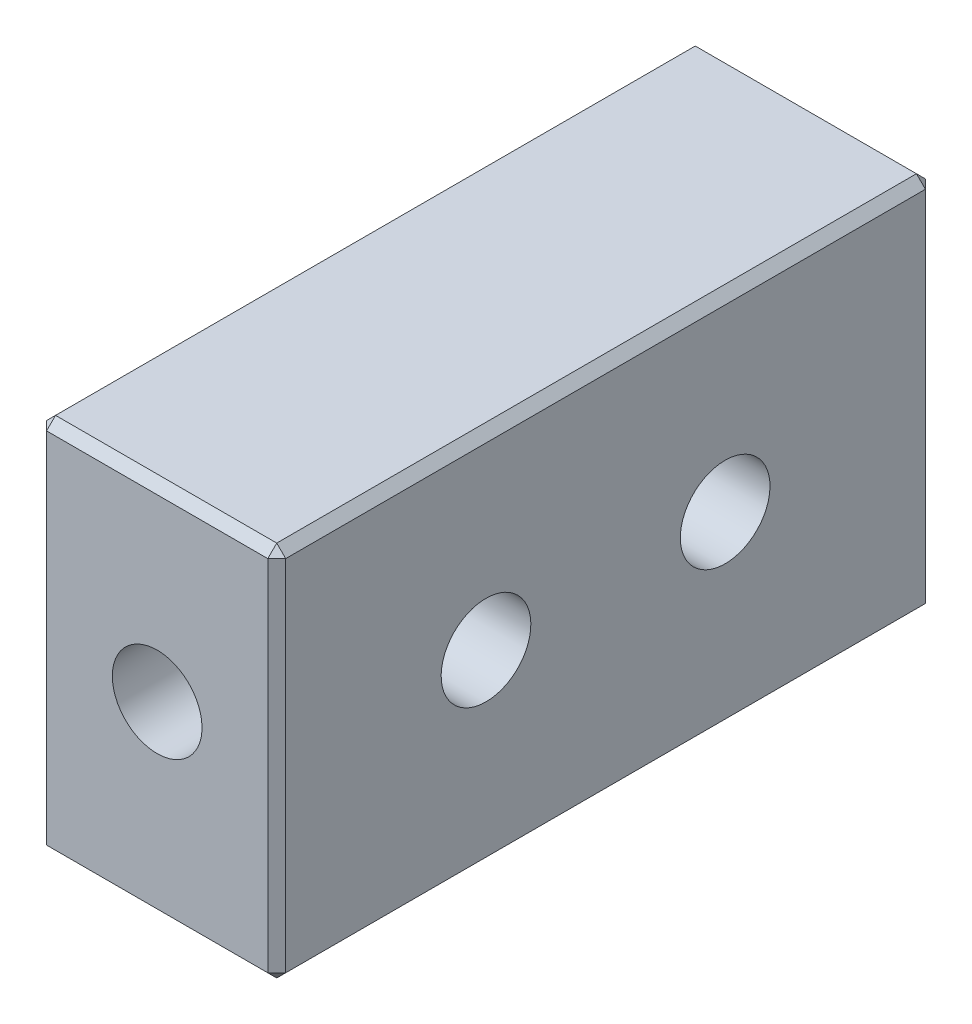
ISO-10303-21;
HEADER;
FILE_DESCRIPTION(('STEP AP214'),'2;1');
FILE_NAME('part.step','',(''),(''),'','','');
FILE_SCHEMA(('AUTOMOTIVE_DESIGN { 1 0 10303 214 1 1 1 1 }'));
ENDSEC;
DATA;
#1=APPLICATION_CONTEXT('core data for automotive mechanical design processes');
#2=APPLICATION_PROTOCOL_DEFINITION('international standard','automotive_design',2000,#1);
#3=PRODUCT_CONTEXT('',#1,'mechanical');
#4=PRODUCT('Part','Part','',(#3));
#5=PRODUCT_RELATED_PRODUCT_CATEGORY('part','',(#4));
#6=PRODUCT_DEFINITION_FORMATION('','',#4);
#7=PRODUCT_DEFINITION_CONTEXT('part definition',#1,'design');
#8=PRODUCT_DEFINITION('design','',#6,#7);
#9=PRODUCT_DEFINITION_SHAPE('','',#8);
#10=(LENGTH_UNIT() NAMED_UNIT(*) SI_UNIT(.MILLI.,.METRE.));
#11=(NAMED_UNIT(*) PLANE_ANGLE_UNIT() SI_UNIT($,.RADIAN.));
#12=(NAMED_UNIT(*) SI_UNIT($,.STERADIAN.) SOLID_ANGLE_UNIT());
#13=UNCERTAINTY_MEASURE_WITH_UNIT(LENGTH_MEASURE(1.E-05),#10,'distance_accuracy_value','');
#14=(GEOMETRIC_REPRESENTATION_CONTEXT(3) GLOBAL_UNCERTAINTY_ASSIGNED_CONTEXT((#13)) GLOBAL_UNIT_ASSIGNED_CONTEXT((#10,
#11,#12)) REPRESENTATION_CONTEXT('',''));
#15=CARTESIAN_POINT('',(0.,0.,0.));
#16=DIRECTION('',(0.,0.,1.));
#17=DIRECTION('',(1.,0.,0.));
#18=AXIS2_PLACEMENT_3D('',#15,#16,#17);
#19=CARTESIAN_POINT('',(4.,6.3,22.));
#20=DIRECTION('',(-1.,0.,0.));
#21=DIRECTION('',(0.,-1.,0.));
#22=AXIS2_PLACEMENT_3D('',#19,#20,#21);
#23=PLANE('',#22);
#24=CARTESIAN_POINT('',(4.,0.,15.));
#25=DIRECTION('',(-1.,0.,0.));
#26=DIRECTION('',(0.,-1.,0.));
#27=AXIS2_PLACEMENT_3D('',#24,#25,#26);
#28=CIRCLE('',#27,1.5);
#29=CARTESIAN_POINT('',(4.,-1.5,15.));
#30=VERTEX_POINT('',#29);
#31=EDGE_CURVE('E135',#30,#30,#28,.T.);
#32=ORIENTED_EDGE('',*,*,#31,.T.);
#33=EDGE_LOOP('',(#32));
#34=FACE_BOUND('',#33,.T.);
#35=CARTESIAN_POINT('',(4.,0.,7.));
#36=DIRECTION('',(-1.,0.,0.));
#37=DIRECTION('',(0.,1.,0.));
#38=AXIS2_PLACEMENT_3D('',#35,#36,#37);
#39=CIRCLE('',#38,1.5);
#40=CARTESIAN_POINT('',(4.,1.5,7.));
#41=VERTEX_POINT('',#40);
#42=EDGE_CURVE('E459',#41,#41,#39,.T.);
#43=ORIENTED_EDGE('',*,*,#42,.T.);
#44=EDGE_LOOP('',(#43));
#45=FACE_BOUND('',#44,.T.);
#46=DIRECTION('',(0.,-1.,0.));
#47=VECTOR('',#46,1.);
#48=CARTESIAN_POINT('',(4.,-6.3,21.7));
#49=LINE('',#48,#47);
#50=CARTESIAN_POINT('',(4.,6.,21.7));
#51=VERTEX_POINT('',#50);
#52=CARTESIAN_POINT('',(4.,-6.,21.7));
#53=VERTEX_POINT('',#52);
#54=EDGE_CURVE('E194',#51,#53,#49,.T.);
#55=ORIENTED_EDGE('',*,*,#54,.T.);
#56=DIRECTION('',(0.,0.,-1.));
#57=VECTOR('',#56,1.);
#58=CARTESIAN_POINT('',(4.,-6.,22.));
#59=LINE('',#58,#57);
#60=CARTESIAN_POINT('',(4.,-6.,0.299999999999998));
#61=VERTEX_POINT('',#60);
#62=EDGE_CURVE('E196',#53,#61,#59,.T.);
#63=ORIENTED_EDGE('',*,*,#62,.T.);
#64=DIRECTION('',(0.,1.,0.));
#65=VECTOR('',#64,1.);
#66=CARTESIAN_POINT('',(4.,6.3,0.299999999999998));
#67=LINE('',#66,#65);
#68=CARTESIAN_POINT('',(4.,6.,0.299999999999998));
#69=VERTEX_POINT('',#68);
#70=EDGE_CURVE('E192',#61,#69,#67,.T.);
#71=ORIENTED_EDGE('',*,*,#70,.T.);
#72=DIRECTION('',(0.,0.,1.));
#73=VECTOR('',#72,1.);
#74=CARTESIAN_POINT('',(4.,6.,22.));
#75=LINE('',#74,#73);
#76=EDGE_CURVE('E190',#69,#51,#75,.T.);
#77=ORIENTED_EDGE('',*,*,#76,.T.);
#78=EDGE_LOOP('',(#55,#63,#71,#77));
#79=FACE_BOUND('',#78,.T.);
#80=ADVANCED_FACE('F36',(#34,#45,#79),#23,.F.);
#81=CARTESIAN_POINT('',(-4.,6.3,22.));
#82=DIRECTION('',(0.,-1.,0.));
#83=DIRECTION('',(0.,0.,-1.));
#84=AXIS2_PLACEMENT_3D('',#81,#82,#83);
#85=PLANE('',#84);
#86=DIRECTION('',(1.,0.,0.));
#87=VECTOR('',#86,1.);
#88=CARTESIAN_POINT('',(4.,6.3,21.7));
#89=LINE('',#88,#87);
#90=CARTESIAN_POINT('',(-3.7,6.3,21.7));
#91=VERTEX_POINT('',#90);
#92=CARTESIAN_POINT('',(3.7,6.3,21.7));
#93=VERTEX_POINT('',#92);
#94=EDGE_CURVE('E46',#91,#93,#89,.T.);
#95=ORIENTED_EDGE('',*,*,#94,.T.);
#96=DIRECTION('',(0.,0.,-1.));
#97=VECTOR('',#96,1.);
#98=CARTESIAN_POINT('',(3.7,6.3,22.));
#99=LINE('',#98,#97);
#100=CARTESIAN_POINT('',(3.7,6.3,0.299999999999998));
#101=VERTEX_POINT('',#100);
#102=EDGE_CURVE('E11',#93,#101,#99,.T.);
#103=ORIENTED_EDGE('',*,*,#102,.T.);
#104=DIRECTION('',(-1.,0.,0.));
#105=VECTOR('',#104,1.);
#106=CARTESIAN_POINT('',(-4.,6.3,0.299999999999998));
#107=LINE('',#106,#105);
#108=CARTESIAN_POINT('',(-3.7,6.3,0.299999999999998));
#109=VERTEX_POINT('',#108);
#110=EDGE_CURVE('E199',#101,#109,#107,.T.);
#111=ORIENTED_EDGE('',*,*,#110,.T.);
#112=DIRECTION('',(0.,0.,1.));
#113=VECTOR('',#112,1.);
#114=CARTESIAN_POINT('',(-3.7,6.3,22.));
#115=LINE('',#114,#113);
#116=EDGE_CURVE('E57',#109,#91,#115,.T.);
#117=ORIENTED_EDGE('',*,*,#116,.T.);
#118=EDGE_LOOP('',(#95,#103,#111,#117));
#119=FACE_BOUND('',#118,.T.);
#120=ADVANCED_FACE('F301',(#119),#85,.F.);
#121=CARTESIAN_POINT('',(-4.,6.3,22.));
#122=DIRECTION('',(1.,0.,0.));
#123=DIRECTION('',(0.,1.,0.));
#124=AXIS2_PLACEMENT_3D('',#121,#122,#123);
#125=PLANE('',#124);
#126=CARTESIAN_POINT('',(-4.,0.,15.));
#127=DIRECTION('',(-1.,0.,0.));
#128=DIRECTION('',(0.,-1.,0.));
#129=AXIS2_PLACEMENT_3D('',#126,#127,#128);
#130=CIRCLE('',#129,1.5);
#131=CARTESIAN_POINT('',(-4.,-1.5,15.));
#132=VERTEX_POINT('',#131);
#133=EDGE_CURVE('E454',#132,#132,#130,.T.);
#134=ORIENTED_EDGE('',*,*,#133,.F.);
#135=EDGE_LOOP('',(#134));
#136=FACE_BOUND('',#135,.T.);
#137=CARTESIAN_POINT('',(-4.,0.,7.));
#138=DIRECTION('',(-1.,0.,0.));
#139=DIRECTION('',(0.,1.,0.));
#140=AXIS2_PLACEMENT_3D('',#137,#138,#139);
#141=CIRCLE('',#140,1.5);
#142=CARTESIAN_POINT('',(-4.,1.5,7.));
#143=VERTEX_POINT('',#142);
#144=EDGE_CURVE('E457',#143,#143,#141,.T.);
#145=ORIENTED_EDGE('',*,*,#144,.F.);
#146=EDGE_LOOP('',(#145));
#147=FACE_BOUND('',#146,.T.);
#148=DIRECTION('',(0.,-1.,0.));
#149=VECTOR('',#148,1.);
#150=CARTESIAN_POINT('',(-4.,6.3,0.299999999999998));
#151=LINE('',#150,#149);
#152=CARTESIAN_POINT('',(-4.,6.,0.299999999999998));
#153=VERTEX_POINT('',#152);
#154=CARTESIAN_POINT('',(-4.,-6.,0.299999999999998));
#155=VERTEX_POINT('',#154);
#156=EDGE_CURVE('E176',#153,#155,#151,.T.);
#157=ORIENTED_EDGE('',*,*,#156,.T.);
#158=DIRECTION('',(0.,0.,1.));
#159=VECTOR('',#158,1.);
#160=CARTESIAN_POINT('',(-4.,-6.,22.));
#161=LINE('',#160,#159);
#162=CARTESIAN_POINT('',(-4.,-6.,21.7));
#163=VERTEX_POINT('',#162);
#164=EDGE_CURVE('E178',#155,#163,#161,.T.);
#165=ORIENTED_EDGE('',*,*,#164,.T.);
#166=DIRECTION('',(0.,1.,0.));
#167=VECTOR('',#166,1.);
#168=CARTESIAN_POINT('',(-4.,6.3,21.7));
#169=LINE('',#168,#167);
#170=CARTESIAN_POINT('',(-4.,6.,21.7));
#171=VERTEX_POINT('',#170);
#172=EDGE_CURVE('E174',#163,#171,#169,.T.);
#173=ORIENTED_EDGE('',*,*,#172,.T.);
#174=DIRECTION('',(0.,0.,-1.));
#175=VECTOR('',#174,1.);
#176=CARTESIAN_POINT('',(-4.,6.,22.));
#177=LINE('',#176,#175);
#178=EDGE_CURVE('E172',#171,#153,#177,.T.);
#179=ORIENTED_EDGE('',*,*,#178,.T.);
#180=EDGE_LOOP('',(#157,#165,#173,#179));
#181=FACE_BOUND('',#180,.T.);
#182=ADVANCED_FACE('F273',(#136,#147,#181),#125,.F.);
#183=CARTESIAN_POINT('',(-4.,-6.3,22.));
#184=DIRECTION('',(0.,1.,0.));
#185=DIRECTION('',(0.,0.,1.));
#186=AXIS2_PLACEMENT_3D('',#183,#184,#185);
#187=PLANE('',#186);
#188=DIRECTION('',(0.,0.,-1.));
#189=VECTOR('',#188,1.);
#190=CARTESIAN_POINT('',(-3.7,-6.3,22.));
#191=LINE('',#190,#189);
#192=CARTESIAN_POINT('',(-3.7,-6.3,21.7));
#193=VERTEX_POINT('',#192);
#194=CARTESIAN_POINT('',(-3.7,-6.3,0.299999999999998));
#195=VERTEX_POINT('',#194);
#196=EDGE_CURVE('E159',#193,#195,#191,.T.);
#197=ORIENTED_EDGE('',*,*,#196,.T.);
#198=DIRECTION('',(1.,0.,0.));
#199=VECTOR('',#198,1.);
#200=CARTESIAN_POINT('',(-4.,-6.3,0.299999999999998));
#201=LINE('',#200,#199);
#202=CARTESIAN_POINT('',(3.7,-6.3,0.299999999999998));
#203=VERTEX_POINT('',#202);
#204=EDGE_CURVE('E130',#195,#203,#201,.T.);
#205=ORIENTED_EDGE('',*,*,#204,.T.);
#206=DIRECTION('',(0.,0.,1.));
#207=VECTOR('',#206,1.);
#208=CARTESIAN_POINT('',(3.7,-6.3,22.));
#209=LINE('',#208,#207);
#210=CARTESIAN_POINT('',(3.7,-6.3,21.7));
#211=VERTEX_POINT('',#210);
#212=EDGE_CURVE('E149',#203,#211,#209,.T.);
#213=ORIENTED_EDGE('',*,*,#212,.T.);
#214=DIRECTION('',(-1.,0.,0.));
#215=VECTOR('',#214,1.);
#216=CARTESIAN_POINT('',(-4.,-6.3,21.7));
#217=LINE('',#216,#215);
#218=EDGE_CURVE('E155',#211,#193,#217,.T.);
#219=ORIENTED_EDGE('',*,*,#218,.T.);
#220=EDGE_LOOP('',(#197,#205,#213,#219));
#221=FACE_BOUND('',#220,.T.);
#222=ADVANCED_FACE('F157',(#221),#187,.F.);
#223=CARTESIAN_POINT('',(0.,0.,22.));
#224=DIRECTION('',(0.,0.,1.));
#225=DIRECTION('',(1.,0.,0.));
#226=AXIS2_PLACEMENT_3D('',#223,#224,#225);
#227=PLANE('',#226);
#228=CARTESIAN_POINT('',(0.,0.,22.));
#229=DIRECTION('',(0.,0.,-1.));
#230=DIRECTION('',(-1.,0.,0.));
#231=AXIS2_PLACEMENT_3D('',#228,#229,#230);
#232=CIRCLE('',#231,1.5);
#233=CARTESIAN_POINT('',(-1.5,0.,22.));
#234=VERTEX_POINT('',#233);
#235=EDGE_CURVE('E473',#234,#234,#232,.T.);
#236=ORIENTED_EDGE('',*,*,#235,.T.);
#237=EDGE_LOOP('',(#236));
#238=FACE_BOUND('',#237,.T.);
#239=DIRECTION('',(0.,-1.,0.));
#240=VECTOR('',#239,1.);
#241=CARTESIAN_POINT('',(-3.7,-6.3,22.));
#242=LINE('',#241,#240);
#243=CARTESIAN_POINT('',(-3.7,6.,22.));
#244=VERTEX_POINT('',#243);
#245=CARTESIAN_POINT('',(-3.7,-6.,22.));
#246=VERTEX_POINT('',#245);
#247=EDGE_CURVE('E185',#244,#246,#242,.T.);
#248=ORIENTED_EDGE('',*,*,#247,.T.);
#249=DIRECTION('',(1.,0.,0.));
#250=VECTOR('',#249,1.);
#251=CARTESIAN_POINT('',(4.,-6.,22.));
#252=LINE('',#251,#250);
#253=CARTESIAN_POINT('',(3.7,-6.,22.));
#254=VERTEX_POINT('',#253);
#255=EDGE_CURVE('E187',#246,#254,#252,.T.);
#256=ORIENTED_EDGE('',*,*,#255,.T.);
#257=DIRECTION('',(0.,1.,0.));
#258=VECTOR('',#257,1.);
#259=CARTESIAN_POINT('',(3.7,6.3,22.));
#260=LINE('',#259,#258);
#261=CARTESIAN_POINT('',(3.7,6.,22.));
#262=VERTEX_POINT('',#261);
#263=EDGE_CURVE('E183',#254,#262,#260,.T.);
#264=ORIENTED_EDGE('',*,*,#263,.T.);
#265=DIRECTION('',(-1.,0.,0.));
#266=VECTOR('',#265,1.);
#267=CARTESIAN_POINT('',(-4.,6.,22.));
#268=LINE('',#267,#266);
#269=EDGE_CURVE('E181',#262,#244,#268,.T.);
#270=ORIENTED_EDGE('',*,*,#269,.T.);
#271=EDGE_LOOP('',(#248,#256,#264,#270));
#272=FACE_BOUND('',#271,.T.);
#273=ADVANCED_FACE('F282',(#238,#272),#227,.T.);
#274=CARTESIAN_POINT('',(0.,0.,0.));
#275=DIRECTION('',(0.,0.,1.));
#276=DIRECTION('',(1.,0.,0.));
#277=AXIS2_PLACEMENT_3D('',#274,#275,#276);
#278=PLANE('',#277);
#279=CARTESIAN_POINT('',(0.,0.,0.));
#280=DIRECTION('',(0.,0.,-1.));
#281=DIRECTION('',(-1.,0.,0.));
#282=AXIS2_PLACEMENT_3D('',#279,#280,#281);
#283=CIRCLE('',#282,1.5);
#284=CARTESIAN_POINT('',(-1.5,0.,0.));
#285=VERTEX_POINT('',#284);
#286=EDGE_CURVE('E465',#285,#285,#283,.T.);
#287=ORIENTED_EDGE('',*,*,#286,.F.);
#288=EDGE_LOOP('',(#287));
#289=FACE_BOUND('',#288,.T.);
#290=DIRECTION('',(0.,-1.,0.));
#291=VECTOR('',#290,1.);
#292=CARTESIAN_POINT('',(3.7,0.,0.));
#293=LINE('',#292,#291);
#294=CARTESIAN_POINT('',(3.7,6.,0.));
#295=VERTEX_POINT('',#294);
#296=CARTESIAN_POINT('',(3.7,-6.,0.));
#297=VERTEX_POINT('',#296);
#298=EDGE_CURVE('E163',#295,#297,#293,.T.);
#299=ORIENTED_EDGE('',*,*,#298,.T.);
#300=DIRECTION('',(-1.,0.,0.));
#301=VECTOR('',#300,1.);
#302=CARTESIAN_POINT('',(0.,-6.,0.));
#303=LINE('',#302,#301);
#304=CARTESIAN_POINT('',(-3.7,-6.,0.));
#305=VERTEX_POINT('',#304);
#306=EDGE_CURVE('E132',#297,#305,#303,.T.);
#307=ORIENTED_EDGE('',*,*,#306,.T.);
#308=DIRECTION('',(0.,1.,0.));
#309=VECTOR('',#308,1.);
#310=CARTESIAN_POINT('',(-3.7,0.,0.));
#311=LINE('',#310,#309);
#312=CARTESIAN_POINT('',(-3.7,6.,0.));
#313=VERTEX_POINT('',#312);
#314=EDGE_CURVE('E169',#305,#313,#311,.T.);
#315=ORIENTED_EDGE('',*,*,#314,.T.);
#316=DIRECTION('',(1.,0.,0.));
#317=VECTOR('',#316,1.);
#318=CARTESIAN_POINT('',(0.,6.,0.));
#319=LINE('',#318,#317);
#320=EDGE_CURVE('E161',#313,#295,#319,.T.);
#321=ORIENTED_EDGE('',*,*,#320,.T.);
#322=EDGE_LOOP('',(#299,#307,#315,#321));
#323=FACE_BOUND('',#322,.T.);
#324=ADVANCED_FACE('F431',(#289,#323),#278,.F.);
#325=CARTESIAN_POINT('',(0.,6.,22.));
#326=DIRECTION('',(0.,0.707106781186547,0.707106781186547));
#327=DIRECTION('',(1.,0.,0.));
#328=AXIS2_PLACEMENT_3D('',#325,#326,#327);
#329=PLANE('',#328);
#330=DIRECTION('',(0.,0.707106781186547,-0.707106781186547));
#331=VECTOR('',#330,1.);
#332=CARTESIAN_POINT('',(-3.7,6.15,21.85));
#333=LINE('',#332,#331);
#334=EDGE_CURVE('E41',#244,#91,#333,.T.);
#335=ORIENTED_EDGE('',*,*,#334,.F.);
#336=ORIENTED_EDGE('',*,*,#269,.F.);
#337=DIRECTION('',(0.,-0.707106781186547,0.707106781186547));
#338=VECTOR('',#337,1.);
#339=CARTESIAN_POINT('',(3.7,6.,22.));
#340=LINE('',#339,#338);
#341=EDGE_CURVE('E252',#93,#262,#340,.T.);
#342=ORIENTED_EDGE('',*,*,#341,.F.);
#343=ORIENTED_EDGE('',*,*,#94,.F.);
#344=EDGE_LOOP('',(#335,#336,#342,#343));
#345=FACE_BOUND('',#344,.T.);
#346=ADVANCED_FACE('F39',(#345),#329,.T.);
#347=CARTESIAN_POINT('',(-4.,6.,21.7));
#348=DIRECTION('',(-0.577350269189626,0.577350269189626,0.577350269189626));
#349=DIRECTION('',(0.707106781186547,0.,0.707106781186547));
#350=AXIS2_PLACEMENT_3D('',#347,#348,#349);
#351=PLANE('',#350);
#352=DIRECTION('',(0.707106781186548,0.,0.707106781186548));
#353=VECTOR('',#352,1.);
#354=CARTESIAN_POINT('',(-4.,6.,21.7));
#355=LINE('',#354,#353);
#356=EDGE_CURVE('E247',#244,#171,#355,.F.);
#357=ORIENTED_EDGE('',*,*,#356,.F.);
#358=ORIENTED_EDGE('',*,*,#334,.T.);
#359=DIRECTION('',(0.707106781186547,0.707106781186547,0.));
#360=VECTOR('',#359,1.);
#361=CARTESIAN_POINT('',(-4.,6.,21.7));
#362=LINE('',#361,#360);
#363=EDGE_CURVE('E250',#171,#91,#362,.T.);
#364=ORIENTED_EDGE('',*,*,#363,.F.);
#365=EDGE_LOOP('',(#357,#358,#364));
#366=FACE_BOUND('',#365,.T.);
#367=ADVANCED_FACE('F262',(#366),#351,.T.);
#368=CARTESIAN_POINT('',(3.7,6.,22.));
#369=DIRECTION('',(0.577350269189626,0.577350269189626,0.577350269189626));
#370=DIRECTION('',(0.707106781186547,0.,-0.707106781186547));
#371=AXIS2_PLACEMENT_3D('',#368,#369,#370);
#372=PLANE('',#371);
#373=DIRECTION('',(0.707106781186547,-0.707106781186547,0.));
#374=VECTOR('',#373,1.);
#375=CARTESIAN_POINT('',(3.85,6.15,21.7));
#376=LINE('',#375,#374);
#377=EDGE_CURVE('E241',#93,#51,#376,.T.);
#378=ORIENTED_EDGE('',*,*,#377,.F.);
#379=ORIENTED_EDGE('',*,*,#341,.T.);
#380=DIRECTION('',(0.707106781186547,0.,-0.707106781186547));
#381=VECTOR('',#380,1.);
#382=CARTESIAN_POINT('',(3.7,6.,22.));
#383=LINE('',#382,#381);
#384=EDGE_CURVE('E244',#51,#262,#383,.F.);
#385=ORIENTED_EDGE('',*,*,#384,.F.);
#386=EDGE_LOOP('',(#378,#379,#385));
#387=FACE_BOUND('',#386,.T.);
#388=ADVANCED_FACE('F295',(#387),#372,.T.);
#389=CARTESIAN_POINT('',(-4.,6.,22.));
#390=DIRECTION('',(0.707106781186547,-0.707106781186547,0.));
#391=DIRECTION('',(0.,0.,-1.));
#392=AXIS2_PLACEMENT_3D('',#389,#390,#391);
#393=PLANE('',#392);
#394=ORIENTED_EDGE('',*,*,#363,.T.);
#395=ORIENTED_EDGE('',*,*,#116,.F.);
#396=DIRECTION('',(-0.707106781186547,-0.707106781186547,0.));
#397=VECTOR('',#396,1.);
#398=CARTESIAN_POINT('',(-3.85,6.15,0.299999999999998));
#399=LINE('',#398,#397);
#400=EDGE_CURVE('E235',#153,#109,#399,.F.);
#401=ORIENTED_EDGE('',*,*,#400,.F.);
#402=ORIENTED_EDGE('',*,*,#178,.F.);
#403=EDGE_LOOP('',(#394,#395,#401,#402));
#404=FACE_BOUND('',#403,.T.);
#405=ADVANCED_FACE('F268',(#404),#393,.F.);
#406=CARTESIAN_POINT('',(-3.7,0.,22.));
#407=DIRECTION('',(-0.707106781186547,0.,0.707106781186547));
#408=DIRECTION('',(0.,1.,0.));
#409=AXIS2_PLACEMENT_3D('',#406,#407,#408);
#410=PLANE('',#409);
#411=ORIENTED_EDGE('',*,*,#356,.T.);
#412=ORIENTED_EDGE('',*,*,#172,.F.);
#413=DIRECTION('',(-0.707106781186547,0.,-0.707106781186547));
#414=VECTOR('',#413,1.);
#415=CARTESIAN_POINT('',(-4.,-6.,21.7));
#416=LINE('',#415,#414);
#417=EDGE_CURVE('E232',#246,#163,#416,.T.);
#418=ORIENTED_EDGE('',*,*,#417,.F.);
#419=ORIENTED_EDGE('',*,*,#247,.F.);
#420=EDGE_LOOP('',(#411,#412,#418,#419));
#421=FACE_BOUND('',#420,.T.);
#422=ADVANCED_FACE('F279',(#421),#410,.T.);
#423=CARTESIAN_POINT('',(0.,-6.,22.));
#424=DIRECTION('',(0.,-0.707106781186547,0.707106781186547));
#425=DIRECTION('',(-1.,0.,0.));
#426=AXIS2_PLACEMENT_3D('',#423,#424,#425);
#427=PLANE('',#426);
#428=DIRECTION('',(0.,-0.707106781186547,-0.707106781186547));
#429=VECTOR('',#428,1.);
#430=CARTESIAN_POINT('',(3.7,-6.,22.));
#431=LINE('',#430,#429);
#432=EDGE_CURVE('E226',#254,#211,#431,.T.);
#433=ORIENTED_EDGE('',*,*,#432,.F.);
#434=ORIENTED_EDGE('',*,*,#255,.F.);
#435=DIRECTION('',(0.,0.707106781186547,0.707106781186547));
#436=VECTOR('',#435,1.);
#437=CARTESIAN_POINT('',(-3.7,-6.15,21.85));
#438=LINE('',#437,#436);
#439=EDGE_CURVE('E229',#193,#246,#438,.T.);
#440=ORIENTED_EDGE('',*,*,#439,.F.);
#441=ORIENTED_EDGE('',*,*,#218,.F.);
#442=EDGE_LOOP('',(#433,#434,#440,#441));
#443=FACE_BOUND('',#442,.T.);
#444=ADVANCED_FACE('F286',(#443),#427,.T.);
#445=CARTESIAN_POINT('',(3.7,0.,22.));
#446=DIRECTION('',(0.707106781186547,0.,0.707106781186547));
#447=DIRECTION('',(0.,-1.,0.));
#448=AXIS2_PLACEMENT_3D('',#445,#446,#447);
#449=PLANE('',#448);
#450=ORIENTED_EDGE('',*,*,#384,.T.);
#451=ORIENTED_EDGE('',*,*,#263,.F.);
#452=DIRECTION('',(-0.707106781186548,0.,0.707106781186548));
#453=VECTOR('',#452,1.);
#454=CARTESIAN_POINT('',(3.7,-6.,22.));
#455=LINE('',#454,#453);
#456=EDGE_CURVE('E224',#53,#254,#455,.T.);
#457=ORIENTED_EDGE('',*,*,#456,.F.);
#458=ORIENTED_EDGE('',*,*,#54,.F.);
#459=EDGE_LOOP('',(#450,#451,#457,#458));
#460=FACE_BOUND('',#459,.T.);
#461=ADVANCED_FACE('F292',(#460),#449,.T.);
#462=CARTESIAN_POINT('',(3.7,6.3,22.));
#463=DIRECTION('',(-0.707106781186547,-0.707106781186547,0.));
#464=DIRECTION('',(0.,0.,-1.));
#465=AXIS2_PLACEMENT_3D('',#462,#463,#464);
#466=PLANE('',#465);
#467=ORIENTED_EDGE('',*,*,#377,.T.);
#468=ORIENTED_EDGE('',*,*,#76,.F.);
#469=DIRECTION('',(-0.707106781186547,0.707106781186547,0.));
#470=VECTOR('',#469,1.);
#471=CARTESIAN_POINT('',(4.,6.,0.299999999999998));
#472=LINE('',#471,#470);
#473=EDGE_CURVE('E221',#101,#69,#472,.F.);
#474=ORIENTED_EDGE('',*,*,#473,.F.);
#475=ORIENTED_EDGE('',*,*,#102,.F.);
#476=EDGE_LOOP('',(#467,#468,#474,#475));
#477=FACE_BOUND('',#476,.T.);
#478=ADVANCED_FACE('F299',(#477),#466,.F.);
#479=CARTESIAN_POINT('',(-4.,6.3,0.299999999999998));
#480=DIRECTION('',(0.,-0.707106781186547,0.707106781186547));
#481=DIRECTION('',(-1.,0.,0.));
#482=AXIS2_PLACEMENT_3D('',#479,#480,#481);
#483=PLANE('',#482);
#484=DIRECTION('',(0.,0.707106781186547,0.707106781186547));
#485=VECTOR('',#484,1.);
#486=CARTESIAN_POINT('',(-3.7,6.,0.));
#487=LINE('',#486,#485);
#488=EDGE_CURVE('E238',#109,#313,#487,.F.);
#489=ORIENTED_EDGE('',*,*,#488,.F.);
#490=ORIENTED_EDGE('',*,*,#110,.F.);
#491=DIRECTION('',(0.,-0.707106781186547,-0.707106781186547));
#492=VECTOR('',#491,1.);
#493=CARTESIAN_POINT('',(3.7,6.15,0.149999999999999));
#494=LINE('',#493,#492);
#495=EDGE_CURVE('E219',#295,#101,#494,.F.);
#496=ORIENTED_EDGE('',*,*,#495,.F.);
#497=ORIENTED_EDGE('',*,*,#320,.F.);
#498=EDGE_LOOP('',(#489,#490,#496,#497));
#499=FACE_BOUND('',#498,.T.);
#500=ADVANCED_FACE('F304',(#499),#483,.F.);
#501=CARTESIAN_POINT('',(-3.7,6.,0.));
#502=DIRECTION('',(-0.577350269189626,0.577350269189626,-0.577350269189626));
#503=DIRECTION('',(-0.707106781186547,0.,0.707106781186547));
#504=AXIS2_PLACEMENT_3D('',#501,#502,#503);
#505=PLANE('',#504);
#506=ORIENTED_EDGE('',*,*,#400,.T.);
#507=ORIENTED_EDGE('',*,*,#488,.T.);
#508=DIRECTION('',(0.707106781186548,0.,-0.707106781186548));
#509=VECTOR('',#508,1.);
#510=CARTESIAN_POINT('',(-3.7,6.,0.));
#511=LINE('',#510,#509);
#512=EDGE_CURVE('E216',#153,#313,#511,.T.);
#513=ORIENTED_EDGE('',*,*,#512,.F.);
#514=EDGE_LOOP('',(#506,#507,#513));
#515=FACE_BOUND('',#514,.T.);
#516=ADVANCED_FACE('F308',(#515),#505,.T.);
#517=CARTESIAN_POINT('',(-4.,-6.,21.7));
#518=DIRECTION('',(-0.577350269189626,-0.577350269189626,0.577350269189626));
#519=DIRECTION('',(0.707106781186547,0.,0.707106781186547));
#520=AXIS2_PLACEMENT_3D('',#517,#518,#519);
#521=PLANE('',#520);
#522=ORIENTED_EDGE('',*,*,#439,.T.);
#523=ORIENTED_EDGE('',*,*,#417,.T.);
#524=DIRECTION('',(-0.707106781186547,0.707106781186547,0.));
#525=VECTOR('',#524,1.);
#526=CARTESIAN_POINT('',(-4.,-6.,21.7));
#527=LINE('',#526,#525);
#528=EDGE_CURVE('E214',#193,#163,#527,.T.);
#529=ORIENTED_EDGE('',*,*,#528,.F.);
#530=EDGE_LOOP('',(#522,#523,#529));
#531=FACE_BOUND('',#530,.T.);
#532=ADVANCED_FACE('F319',(#531),#521,.T.);
#533=CARTESIAN_POINT('',(3.7,-6.,22.));
#534=DIRECTION('',(0.577350269189626,-0.577350269189626,0.577350269189626));
#535=DIRECTION('',(0.707106781186547,0.,-0.707106781186547));
#536=AXIS2_PLACEMENT_3D('',#533,#534,#535);
#537=PLANE('',#536);
#538=ORIENTED_EDGE('',*,*,#456,.T.);
#539=ORIENTED_EDGE('',*,*,#432,.T.);
#540=DIRECTION('',(-0.707106781186547,-0.707106781186547,0.));
#541=VECTOR('',#540,1.);
#542=CARTESIAN_POINT('',(3.85,-6.15,21.7));
#543=LINE('',#542,#541);
#544=EDGE_CURVE('E152',#53,#211,#543,.T.);
#545=ORIENTED_EDGE('',*,*,#544,.F.);
#546=EDGE_LOOP('',(#538,#539,#545));
#547=FACE_BOUND('',#546,.T.);
#548=ADVANCED_FACE('F321',(#547),#537,.T.);
#549=CARTESIAN_POINT('',(4.,6.,0.299999999999998));
#550=DIRECTION('',(0.577350269189626,0.577350269189626,-0.577350269189626));
#551=DIRECTION('',(-0.707106781186547,0.,-0.707106781186547));
#552=AXIS2_PLACEMENT_3D('',#549,#550,#551);
#553=PLANE('',#552);
#554=ORIENTED_EDGE('',*,*,#495,.T.);
#555=ORIENTED_EDGE('',*,*,#473,.T.);
#556=DIRECTION('',(0.707106781186547,0.,0.707106781186547));
#557=VECTOR('',#556,1.);
#558=CARTESIAN_POINT('',(4.,6.,0.299999999999998));
#559=LINE('',#558,#557);
#560=EDGE_CURVE('E210',#295,#69,#559,.T.);
#561=ORIENTED_EDGE('',*,*,#560,.F.);
#562=EDGE_LOOP('',(#554,#555,#561));
#563=FACE_BOUND('',#562,.T.);
#564=ADVANCED_FACE('F327',(#563),#553,.T.);
#565=CARTESIAN_POINT('',(-4.,6.3,0.299999999999998));
#566=DIRECTION('',(0.707106781186547,0.,0.707106781186547));
#567=DIRECTION('',(0.,-1.,0.));
#568=AXIS2_PLACEMENT_3D('',#565,#566,#567);
#569=PLANE('',#568);
#570=ORIENTED_EDGE('',*,*,#512,.T.);
#571=ORIENTED_EDGE('',*,*,#314,.F.);
#572=DIRECTION('',(-0.707106781186547,0.,0.707106781186547));
#573=VECTOR('',#572,1.);
#574=CARTESIAN_POINT('',(-3.7,-6.,0.));
#575=LINE('',#574,#573);
#576=EDGE_CURVE('E207',#155,#305,#575,.F.);
#577=ORIENTED_EDGE('',*,*,#576,.F.);
#578=ORIENTED_EDGE('',*,*,#156,.F.);
#579=EDGE_LOOP('',(#570,#571,#577,#578));
#580=FACE_BOUND('',#579,.T.);
#581=ADVANCED_FACE('F312',(#580),#569,.F.);
#582=CARTESIAN_POINT('',(-3.7,-6.3,22.));
#583=DIRECTION('',(0.707106781186547,0.707106781186547,0.));
#584=DIRECTION('',(0.,0.,-1.));
#585=AXIS2_PLACEMENT_3D('',#582,#583,#584);
#586=PLANE('',#585);
#587=ORIENTED_EDGE('',*,*,#528,.T.);
#588=ORIENTED_EDGE('',*,*,#164,.F.);
#589=DIRECTION('',(0.707106781186547,-0.707106781186547,0.));
#590=VECTOR('',#589,1.);
#591=CARTESIAN_POINT('',(-3.85,-6.15,0.299999999999998));
#592=LINE('',#591,#590);
#593=EDGE_CURVE('E146',#195,#155,#592,.F.);
#594=ORIENTED_EDGE('',*,*,#593,.F.);
#595=ORIENTED_EDGE('',*,*,#196,.F.);
#596=EDGE_LOOP('',(#587,#588,#594,#595));
#597=FACE_BOUND('',#596,.T.);
#598=ADVANCED_FACE('F317',(#597),#586,.F.);
#599=CARTESIAN_POINT('',(4.,-6.,22.));
#600=DIRECTION('',(-0.707106781186547,0.707106781186547,0.));
#601=DIRECTION('',(0.,0.,-1.));
#602=AXIS2_PLACEMENT_3D('',#599,#600,#601);
#603=PLANE('',#602);
#604=ORIENTED_EDGE('',*,*,#544,.T.);
#605=ORIENTED_EDGE('',*,*,#212,.F.);
#606=DIRECTION('',(0.707106781186547,0.707106781186547,0.));
#607=VECTOR('',#606,1.);
#608=CARTESIAN_POINT('',(3.7,-6.3,0.299999999999998));
#609=LINE('',#608,#607);
#610=EDGE_CURVE('E138',#61,#203,#609,.F.);
#611=ORIENTED_EDGE('',*,*,#610,.F.);
#612=ORIENTED_EDGE('',*,*,#62,.F.);
#613=EDGE_LOOP('',(#604,#605,#611,#612));
#614=FACE_BOUND('',#613,.T.);
#615=ADVANCED_FACE('F150',(#614),#603,.F.);
#616=CARTESIAN_POINT('',(4.,6.3,0.299999999999998));
#617=DIRECTION('',(-0.707106781186547,0.,0.707106781186547));
#618=DIRECTION('',(0.,1.,0.));
#619=AXIS2_PLACEMENT_3D('',#616,#617,#618);
#620=PLANE('',#619);
#621=ORIENTED_EDGE('',*,*,#560,.T.);
#622=ORIENTED_EDGE('',*,*,#70,.F.);
#623=DIRECTION('',(-0.707106781186548,0.,-0.707106781186548));
#624=VECTOR('',#623,1.);
#625=CARTESIAN_POINT('',(3.85,-6.,0.149999999999999));
#626=LINE('',#625,#624);
#627=EDGE_CURVE('E142',#297,#61,#626,.F.);
#628=ORIENTED_EDGE('',*,*,#627,.F.);
#629=ORIENTED_EDGE('',*,*,#298,.F.);
#630=EDGE_LOOP('',(#621,#622,#628,#629));
#631=FACE_BOUND('',#630,.T.);
#632=ADVANCED_FACE('F359',(#631),#620,.F.);
#633=CARTESIAN_POINT('',(-3.7,-6.,0.));
#634=DIRECTION('',(-0.577350269189626,-0.577350269189626,-0.577350269189626));
#635=DIRECTION('',(-0.707106781186547,0.,0.707106781186547));
#636=AXIS2_PLACEMENT_3D('',#633,#634,#635);
#637=PLANE('',#636);
#638=ORIENTED_EDGE('',*,*,#593,.T.);
#639=ORIENTED_EDGE('',*,*,#576,.T.);
#640=DIRECTION('',(0.,0.707106781186547,-0.707106781186547));
#641=VECTOR('',#640,1.);
#642=CARTESIAN_POINT('',(-3.7,-6.,0.));
#643=LINE('',#642,#641);
#644=EDGE_CURVE('E134',#195,#305,#643,.T.);
#645=ORIENTED_EDGE('',*,*,#644,.F.);
#646=EDGE_LOOP('',(#638,#639,#645));
#647=FACE_BOUND('',#646,.T.);
#648=ADVANCED_FACE('F315',(#647),#637,.T.);
#649=CARTESIAN_POINT('',(3.7,-6.3,0.299999999999998));
#650=DIRECTION('',(0.577350269189626,-0.577350269189626,-0.577350269189626));
#651=DIRECTION('',(-0.707106781186547,0.,-0.707106781186547));
#652=AXIS2_PLACEMENT_3D('',#649,#650,#651);
#653=PLANE('',#652);
#654=ORIENTED_EDGE('',*,*,#627,.T.);
#655=ORIENTED_EDGE('',*,*,#610,.T.);
#656=DIRECTION('',(0.,-0.707106781186547,0.707106781186547));
#657=VECTOR('',#656,1.);
#658=CARTESIAN_POINT('',(3.7,-6.3,0.299999999999998));
#659=LINE('',#658,#657);
#660=EDGE_CURVE('E126',#297,#203,#659,.T.);
#661=ORIENTED_EDGE('',*,*,#660,.F.);
#662=EDGE_LOOP('',(#654,#655,#661));
#663=FACE_BOUND('',#662,.T.);
#664=ADVANCED_FACE('F140',(#663),#653,.T.);
#665=CARTESIAN_POINT('',(-4.,-6.3,0.299999999999998));
#666=DIRECTION('',(0.,0.707106781186547,0.707106781186547));
#667=DIRECTION('',(1.,0.,0.));
#668=AXIS2_PLACEMENT_3D('',#665,#666,#667);
#669=PLANE('',#668);
#670=ORIENTED_EDGE('',*,*,#644,.T.);
#671=ORIENTED_EDGE('',*,*,#306,.F.);
#672=ORIENTED_EDGE('',*,*,#660,.T.);
#673=ORIENTED_EDGE('',*,*,#204,.F.);
#674=EDGE_LOOP('',(#670,#671,#672,#673));
#675=FACE_BOUND('',#674,.T.);
#676=ADVANCED_FACE('F128',(#675),#669,.F.);
#677=CARTESIAN_POINT('',(4.,0.,7.));
#678=DIRECTION('',(-1.,0.,0.));
#679=DIRECTION('',(0.,-1.,0.));
#680=AXIS2_PLACEMENT_3D('',#677,#678,#679);
#681=CYLINDRICAL_SURFACE('',#680,1.5);
#682=ORIENTED_EDGE('',*,*,#42,.F.);
#683=EDGE_LOOP('',(#682));
#684=FACE_BOUND('',#683,.T.);
#685=ORIENTED_EDGE('',*,*,#144,.T.);
#686=EDGE_LOOP('',(#685));
#687=FACE_BOUND('',#686,.T.);
#688=ADVANCED_FACE('F348',(#684,#687),#681,.F.);
#689=CARTESIAN_POINT('',(4.,0.,15.));
#690=DIRECTION('',(-1.,0.,0.));
#691=DIRECTION('',(0.,-1.,0.));
#692=AXIS2_PLACEMENT_3D('',#689,#690,#691);
#693=CYLINDRICAL_SURFACE('',#692,1.5);
#694=ORIENTED_EDGE('',*,*,#31,.F.);
#695=EDGE_LOOP('',(#694));
#696=FACE_BOUND('',#695,.T.);
#697=ORIENTED_EDGE('',*,*,#133,.T.);
#698=EDGE_LOOP('',(#697));
#699=FACE_BOUND('',#698,.T.);
#700=ADVANCED_FACE('F497',(#696,#699),#693,.F.);
#701=CARTESIAN_POINT('',(0.,0.,4.));
#702=DIRECTION('',(0.,0.,-1.));
#703=DIRECTION('',(-1.,0.,0.));
#704=AXIS2_PLACEMENT_3D('',#701,#702,#703);
#705=CYLINDRICAL_SURFACE('',#704,1.5);
#706=CARTESIAN_POINT('',(0.,0.,4.));
#707=DIRECTION('',(0.,0.,-1.));
#708=DIRECTION('',(-1.,0.,0.));
#709=AXIS2_PLACEMENT_3D('',#706,#707,#708);
#710=CIRCLE('',#709,1.5);
#711=CARTESIAN_POINT('',(-1.5,0.,4.));
#712=VERTEX_POINT('',#711);
#713=EDGE_CURVE('E460',#712,#712,#710,.T.);
#714=ORIENTED_EDGE('',*,*,#713,.F.);
#715=EDGE_LOOP('',(#714));
#716=FACE_BOUND('',#715,.T.);
#717=ORIENTED_EDGE('',*,*,#286,.T.);
#718=EDGE_LOOP('',(#717));
#719=FACE_BOUND('',#718,.T.);
#720=ADVANCED_FACE('F493',(#716,#719),#705,.F.);
#721=CARTESIAN_POINT('',(0.,0.,4.));
#722=DIRECTION('',(0.,0.,-1.));
#723=DIRECTION('',(-1.,0.,0.));
#724=AXIS2_PLACEMENT_3D('',#721,#722,#723);
#725=PLANE('',#724);
#726=ORIENTED_EDGE('',*,*,#713,.T.);
#727=EDGE_LOOP('',(#726));
#728=FACE_BOUND('',#727,.T.);
#729=ADVANCED_FACE('F488',(#728),#725,.T.);
#730=CARTESIAN_POINT('',(0.,0.,18.));
#731=DIRECTION('',(0.,0.,1.));
#732=DIRECTION('',(1.,0.,0.));
#733=AXIS2_PLACEMENT_3D('',#730,#731,#732);
#734=CYLINDRICAL_SURFACE('',#733,1.5);
#735=CARTESIAN_POINT('',(0.,0.,18.));
#736=DIRECTION('',(0.,0.,-1.));
#737=DIRECTION('',(-1.,0.,0.));
#738=AXIS2_PLACEMENT_3D('',#735,#736,#737);
#739=CIRCLE('',#738,1.5);
#740=CARTESIAN_POINT('',(-1.5,0.,18.));
#741=VERTEX_POINT('',#740);
#742=EDGE_CURVE('E471',#741,#741,#739,.T.);
#743=ORIENTED_EDGE('',*,*,#742,.T.);
#744=EDGE_LOOP('',(#743));
#745=FACE_BOUND('',#744,.T.);
#746=ORIENTED_EDGE('',*,*,#235,.F.);
#747=EDGE_LOOP('',(#746));
#748=FACE_BOUND('',#747,.T.);
#749=ADVANCED_FACE('F479',(#745,#748),#734,.F.);
#750=CARTESIAN_POINT('',(0.,0.,18.));
#751=DIRECTION('',(0.,0.,1.));
#752=DIRECTION('',(-1.,0.,0.));
#753=AXIS2_PLACEMENT_3D('',#750,#751,#752);
#754=PLANE('',#753);
#755=ORIENTED_EDGE('',*,*,#742,.F.);
#756=EDGE_LOOP('',(#755));
#757=FACE_BOUND('',#756,.T.);
#758=ADVANCED_FACE('F482',(#757),#754,.T.);
#759=CLOSED_SHELL('',(#80,#120,#182,#222,#273,#324,#346,#367,#388,#405,#422,#444,#461,#478,#500,
#516,#532,#548,#564,#581,#598,#615,#632,#648,#664,#676,#688,#700,#720,#729,#749,#758));
#760=MANIFOLD_SOLID_BREP('B2',#759);
#761=ADVANCED_BREP_SHAPE_REPRESENTATION('',(#18,#760),#14);
#762=SHAPE_DEFINITION_REPRESENTATION(#9,#761);
ENDSEC;
END-ISO-10303-21;
